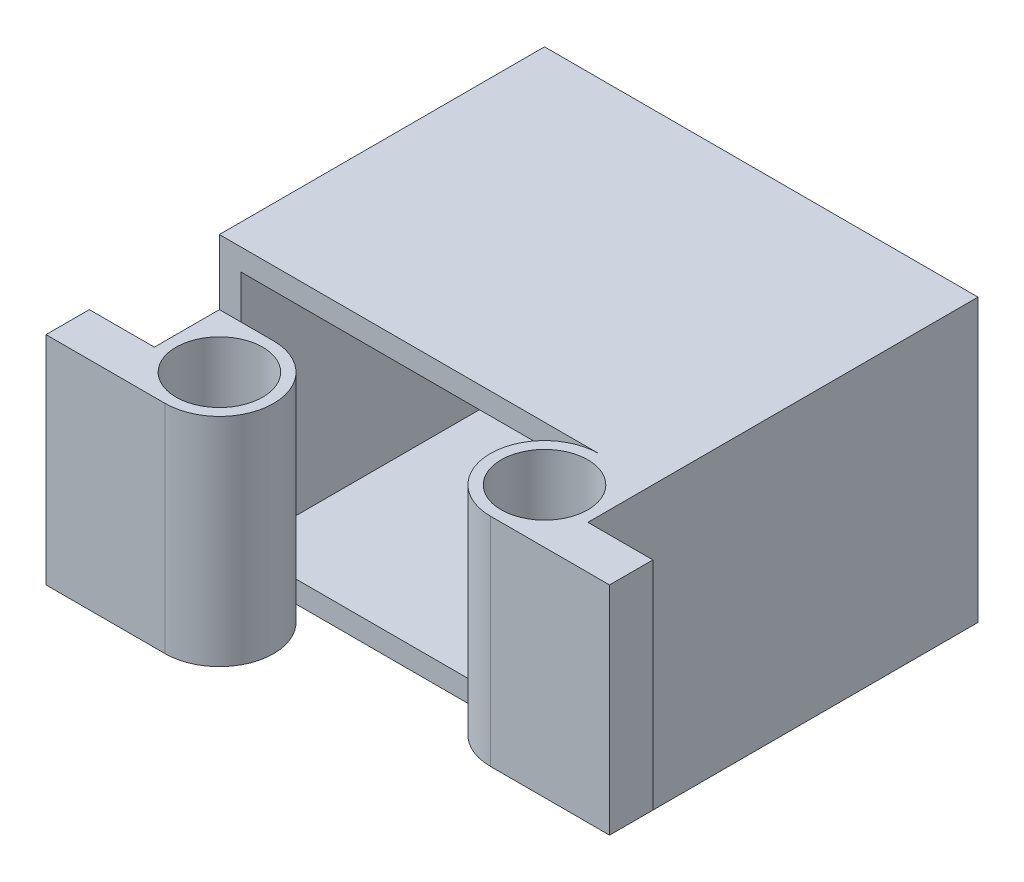
ISO-10303-21;
HEADER;
FILE_DESCRIPTION(('STEP AP214'),'2;1');
FILE_NAME('part.step','',(''),(''),'','','');
FILE_SCHEMA(('AUTOMOTIVE_DESIGN { 1 0 10303 214 1 1 1 1 }'));
ENDSEC;
DATA;
#1=APPLICATION_CONTEXT('core data for automotive mechanical design processes');
#2=APPLICATION_PROTOCOL_DEFINITION('international standard','automotive_design',2000,#1);
#3=PRODUCT_CONTEXT('',#1,'mechanical');
#4=PRODUCT('Part','Part','',(#3));
#5=PRODUCT_RELATED_PRODUCT_CATEGORY('part','',(#4));
#6=PRODUCT_DEFINITION_FORMATION('','',#4);
#7=PRODUCT_DEFINITION_CONTEXT('part definition',#1,'design');
#8=PRODUCT_DEFINITION('design','',#6,#7);
#9=PRODUCT_DEFINITION_SHAPE('','',#8);
#10=(LENGTH_UNIT() NAMED_UNIT(*) SI_UNIT(.MILLI.,.METRE.));
#11=(NAMED_UNIT(*) PLANE_ANGLE_UNIT() SI_UNIT($,.RADIAN.));
#12=(NAMED_UNIT(*) SI_UNIT($,.STERADIAN.) SOLID_ANGLE_UNIT());
#13=UNCERTAINTY_MEASURE_WITH_UNIT(LENGTH_MEASURE(1.E-05),#10,'distance_accuracy_value','');
#14=(GEOMETRIC_REPRESENTATION_CONTEXT(3) GLOBAL_UNCERTAINTY_ASSIGNED_CONTEXT((#13)) GLOBAL_UNIT_ASSIGNED_CONTEXT((#10,
#11,#12)) REPRESENTATION_CONTEXT('',''));
#15=CARTESIAN_POINT('',(0.,0.,0.));
#16=DIRECTION('',(0.,0.,1.));
#17=DIRECTION('',(1.,0.,0.));
#18=AXIS2_PLACEMENT_3D('',#15,#16,#17);
#19=CARTESIAN_POINT('',(10.,-6.5,15.));
#20=DIRECTION('',(-1.,0.,0.));
#21=DIRECTION('',(0.,0.,1.));
#22=AXIS2_PLACEMENT_3D('',#19,#20,#21);
#23=PLANE('',#22);
#24=DIRECTION('',(0.,1.,0.));
#25=VECTOR('',#24,1.);
#26=CARTESIAN_POINT('',(10.,6.5,18.));
#27=LINE('',#26,#25);
#28=CARTESIAN_POINT('',(10.,-3.5,18.));
#29=VERTEX_POINT('',#28);
#30=CARTESIAN_POINT('',(10.,6.5,18.));
#31=VERTEX_POINT('',#30);
#32=EDGE_CURVE('E58',#29,#31,#27,.T.);
#33=ORIENTED_EDGE('',*,*,#32,.F.);
#34=DIRECTION('',(0.,0.,1.));
#35=VECTOR('',#34,1.);
#36=CARTESIAN_POINT('',(10.,-3.5,0.));
#37=LINE('',#36,#35);
#38=CARTESIAN_POINT('',(10.,-3.5,15.));
#39=VERTEX_POINT('',#38);
#40=EDGE_CURVE('E217',#39,#29,#37,.T.);
#41=ORIENTED_EDGE('',*,*,#40,.F.);
#42=DIRECTION('',(0.,1.,0.));
#43=VECTOR('',#42,1.);
#44=CARTESIAN_POINT('',(10.,-6.5,15.));
#45=LINE('',#44,#43);
#46=CARTESIAN_POINT('',(10.,-6.5,15.));
#47=VERTEX_POINT('',#46);
#48=EDGE_CURVE('E375',#47,#39,#45,.T.);
#49=ORIENTED_EDGE('',*,*,#48,.F.);
#50=DIRECTION('',(0.,0.,-1.));
#51=VECTOR('',#50,1.);
#52=CARTESIAN_POINT('',(10.,-6.5,15.));
#53=LINE('',#52,#51);
#54=CARTESIAN_POINT('',(10.,-6.5,0.));
#55=VERTEX_POINT('',#54);
#56=EDGE_CURVE('E390',#47,#55,#53,.T.);
#57=ORIENTED_EDGE('',*,*,#56,.T.);
#58=DIRECTION('',(0.,1.,0.));
#59=VECTOR('',#58,1.);
#60=CARTESIAN_POINT('',(10.,-6.5,0.));
#61=LINE('',#60,#59);
#62=CARTESIAN_POINT('',(10.,6.5,0.));
#63=VERTEX_POINT('',#62);
#64=EDGE_CURVE('E337',#55,#63,#61,.T.);
#65=ORIENTED_EDGE('',*,*,#64,.T.);
#66=DIRECTION('',(0.,0.,-1.));
#67=VECTOR('',#66,1.);
#68=CARTESIAN_POINT('',(10.,6.5,15.));
#69=LINE('',#68,#67);
#70=EDGE_CURVE('E410',#31,#63,#69,.T.);
#71=ORIENTED_EDGE('',*,*,#70,.F.);
#72=EDGE_LOOP('',(#33,#41,#49,#57,#65,#71));
#73=FACE_BOUND('',#72,.T.);
#74=ADVANCED_FACE('F41',(#73),#23,.F.);
#75=CARTESIAN_POINT('',(0.,-6.5,20.));
#76=DIRECTION('',(0.,0.,1.));
#77=DIRECTION('',(1.,0.,0.));
#78=AXIS2_PLACEMENT_3D('',#75,#76,#77);
#79=PLANE('',#78);
#80=DIRECTION('',(1.,0.,0.));
#81=VECTOR('',#80,1.);
#82=CARTESIAN_POINT('',(0.,3.5,20.));
#83=LINE('',#82,#81);
#84=CARTESIAN_POINT('',(-13.,3.5,20.));
#85=VERTEX_POINT('',#84);
#86=CARTESIAN_POINT('',(-7.5,3.5,20.));
#87=VERTEX_POINT('',#86);
#88=EDGE_CURVE('E439',#85,#87,#83,.T.);
#89=ORIENTED_EDGE('',*,*,#88,.F.);
#90=DIRECTION('',(0.,1.,0.));
#91=VECTOR('',#90,1.);
#92=CARTESIAN_POINT('',(-13.,3.5,20.));
#93=LINE('',#92,#91);
#94=CARTESIAN_POINT('',(-13.,-6.5,20.));
#95=VERTEX_POINT('',#94);
#96=EDGE_CURVE('E414',#95,#85,#93,.T.);
#97=ORIENTED_EDGE('',*,*,#96,.F.);
#98=DIRECTION('',(1.,0.,0.));
#99=VECTOR('',#98,1.);
#100=CARTESIAN_POINT('',(0.,-6.5,20.));
#101=LINE('',#100,#99);
#102=CARTESIAN_POINT('',(-7.5,-6.5,20.));
#103=VERTEX_POINT('',#102);
#104=EDGE_CURVE('E440',#95,#103,#101,.T.);
#105=ORIENTED_EDGE('',*,*,#104,.T.);
#106=DIRECTION('',(0.,1.,0.));
#107=VECTOR('',#106,1.);
#108=CARTESIAN_POINT('',(-7.5,-6.5,20.));
#109=LINE('',#108,#107);
#110=EDGE_CURVE('E45',#103,#87,#109,.T.);
#111=ORIENTED_EDGE('',*,*,#110,.T.);
#112=EDGE_LOOP('',(#89,#97,#105,#111));
#113=FACE_BOUND('',#112,.T.);
#114=ADVANCED_FACE('F43',(#113),#79,.T.);
#115=CARTESIAN_POINT('',(-10.,-6.5,0.));
#116=DIRECTION('',(-1.,0.,0.));
#117=DIRECTION('',(0.,0.,1.));
#118=AXIS2_PLACEMENT_3D('',#115,#116,#117);
#119=PLANE('',#118);
#120=DIRECTION('',(0.,-1.,0.));
#121=VECTOR('',#120,1.);
#122=CARTESIAN_POINT('',(-10.,3.5,18.));
#123=LINE('',#122,#121);
#124=CARTESIAN_POINT('',(-10.,3.5,18.));
#125=VERTEX_POINT('',#124);
#126=CARTESIAN_POINT('',(-10.,-6.5,18.));
#127=VERTEX_POINT('',#126);
#128=EDGE_CURVE('E413',#125,#127,#123,.T.);
#129=ORIENTED_EDGE('',*,*,#128,.F.);
#130=DIRECTION('',(0.,0.,1.));
#131=VECTOR('',#130,1.);
#132=CARTESIAN_POINT('',(-10.,3.5,0.));
#133=LINE('',#132,#131);
#134=CARTESIAN_POINT('',(-10.,3.5,15.));
#135=VERTEX_POINT('',#134);
#136=EDGE_CURVE('E467',#135,#125,#133,.T.);
#137=ORIENTED_EDGE('',*,*,#136,.F.);
#138=DIRECTION('',(0.,-1.,0.));
#139=VECTOR('',#138,1.);
#140=CARTESIAN_POINT('',(-10.,-6.5,15.));
#141=LINE('',#140,#139);
#142=CARTESIAN_POINT('',(-10.,6.5,15.));
#143=VERTEX_POINT('',#142);
#144=EDGE_CURVE('E383',#143,#135,#141,.T.);
#145=ORIENTED_EDGE('',*,*,#144,.F.);
#146=DIRECTION('',(0.,0.,-1.));
#147=VECTOR('',#146,1.);
#148=CARTESIAN_POINT('',(-10.,6.5,15.));
#149=LINE('',#148,#147);
#150=CARTESIAN_POINT('',(-10.,6.5,0.));
#151=VERTEX_POINT('',#150);
#152=EDGE_CURVE('E406',#143,#151,#149,.T.);
#153=ORIENTED_EDGE('',*,*,#152,.T.);
#154=DIRECTION('',(0.,-1.,0.));
#155=VECTOR('',#154,1.);
#156=CARTESIAN_POINT('',(-10.,-6.5,0.));
#157=LINE('',#156,#155);
#158=CARTESIAN_POINT('',(-10.,-6.5,0.));
#159=VERTEX_POINT('',#158);
#160=EDGE_CURVE('E397',#151,#159,#157,.T.);
#161=ORIENTED_EDGE('',*,*,#160,.T.);
#162=DIRECTION('',(0.,0.,1.));
#163=VECTOR('',#162,1.);
#164=CARTESIAN_POINT('',(-10.,-6.5,0.));
#165=LINE('',#164,#163);
#166=EDGE_CURVE('E448',#159,#127,#165,.T.);
#167=ORIENTED_EDGE('',*,*,#166,.T.);
#168=EDGE_LOOP('',(#129,#137,#145,#153,#161,#167));
#169=FACE_BOUND('',#168,.T.);
#170=ADVANCED_FACE('F498',(#169),#119,.T.);
#171=CARTESIAN_POINT('',(0.,-6.5,15.));
#172=DIRECTION('',(0.,0.,1.));
#173=DIRECTION('',(1.,0.,0.));
#174=AXIS2_PLACEMENT_3D('',#171,#172,#173);
#175=PLANE('',#174);
#176=DIRECTION('',(1.,0.,0.));
#177=VECTOR('',#176,1.);
#178=CARTESIAN_POINT('',(0.,-5.5,15.));
#179=LINE('',#178,#177);
#180=CARTESIAN_POINT('',(-9.,-5.5,15.));
#181=VERTEX_POINT('',#180);
#182=CARTESIAN_POINT('',(-7.5,-5.5,15.));
#183=VERTEX_POINT('',#182);
#184=EDGE_CURVE('E66',#181,#183,#179,.T.);
#185=ORIENTED_EDGE('',*,*,#184,.F.);
#186=DIRECTION('',(0.,-1.,0.));
#187=VECTOR('',#186,1.);
#188=CARTESIAN_POINT('',(-9.,0.,15.));
#189=LINE('',#188,#187);
#190=CARTESIAN_POINT('',(-9.,3.5,15.));
#191=VERTEX_POINT('',#190);
#192=EDGE_CURVE('E367',#191,#181,#189,.T.);
#193=ORIENTED_EDGE('',*,*,#192,.F.);
#194=DIRECTION('',(1.,0.,0.));
#195=VECTOR('',#194,1.);
#196=CARTESIAN_POINT('',(0.,3.5,15.));
#197=LINE('',#196,#195);
#198=CARTESIAN_POINT('',(-7.5,3.5,15.));
#199=VERTEX_POINT('',#198);
#200=EDGE_CURVE('E462',#191,#199,#197,.T.);
#201=ORIENTED_EDGE('',*,*,#200,.T.);
#202=DIRECTION('',(0.,1.,0.));
#203=VECTOR('',#202,1.);
#204=CARTESIAN_POINT('',(-7.5,-6.5,15.));
#205=LINE('',#204,#203);
#206=EDGE_CURVE('E51',#183,#199,#205,.T.);
#207=ORIENTED_EDGE('',*,*,#206,.F.);
#208=EDGE_LOOP('',(#185,#193,#201,#207));
#209=FACE_BOUND('',#208,.T.);
#210=ADVANCED_FACE('F643',(#209),#175,.F.);
#211=CARTESIAN_POINT('',(-7.5,-6.5,17.5));
#212=DIRECTION('',(0.,1.,0.));
#213=DIRECTION('',(0.,0.,1.));
#214=AXIS2_PLACEMENT_3D('',#211,#212,#213);
#215=CYLINDRICAL_SURFACE('',#214,2.5);
#216=CARTESIAN_POINT('',(-7.5,3.5,17.5));
#217=DIRECTION('',(0.,1.,0.));
#218=DIRECTION('',(0.,0.,1.));
#219=AXIS2_PLACEMENT_3D('',#216,#217,#218);
#220=CIRCLE('',#219,2.5);
#221=EDGE_CURVE('E458',#87,#199,#220,.T.);
#222=ORIENTED_EDGE('',*,*,#221,.F.);
#223=ORIENTED_EDGE('',*,*,#110,.F.);
#224=CARTESIAN_POINT('',(-7.5,-6.5,17.5));
#225=DIRECTION('',(0.,1.,0.));
#226=DIRECTION('',(0.,0.,1.));
#227=AXIS2_PLACEMENT_3D('',#224,#225,#226);
#228=CIRCLE('',#227,2.5);
#229=CARTESIAN_POINT('',(-7.5,-6.5,15.));
#230=VERTEX_POINT('',#229);
#231=EDGE_CURVE('E444',#103,#230,#228,.T.);
#232=ORIENTED_EDGE('',*,*,#231,.T.);
#233=EDGE_CURVE('E11',#230,#183,#205,.T.);
#234=ORIENTED_EDGE('',*,*,#233,.T.);
#235=ORIENTED_EDGE('',*,*,#206,.T.);
#236=EDGE_LOOP('',(#222,#223,#232,#234,#235));
#237=FACE_BOUND('',#236,.T.);
#238=ADVANCED_FACE('F527',(#237),#215,.T.);
#239=CARTESIAN_POINT('',(-7.5,-6.5,17.5));
#240=DIRECTION('',(0.,1.,0.));
#241=DIRECTION('',(0.,0.,1.));
#242=AXIS2_PLACEMENT_3D('',#239,#240,#241);
#243=CYLINDRICAL_SURFACE('',#242,2.);
#244=CARTESIAN_POINT('',(-7.5,-6.5,17.5));
#245=DIRECTION('',(0.,1.,0.));
#246=DIRECTION('',(0.,0.,1.));
#247=AXIS2_PLACEMENT_3D('',#244,#245,#246);
#248=CIRCLE('',#247,2.);
#249=CARTESIAN_POINT('',(-7.5,-6.5,19.5));
#250=VERTEX_POINT('',#249);
#251=EDGE_CURVE('E451',#250,#250,#248,.T.);
#252=ORIENTED_EDGE('',*,*,#251,.F.);
#253=EDGE_LOOP('',(#252));
#254=FACE_BOUND('',#253,.T.);
#255=CARTESIAN_POINT('',(-7.5,3.5,17.5));
#256=DIRECTION('',(0.,1.,0.));
#257=DIRECTION('',(0.,0.,1.));
#258=AXIS2_PLACEMENT_3D('',#255,#256,#257);
#259=CIRCLE('',#258,2.);
#260=CARTESIAN_POINT('',(-7.5,3.5,19.5));
#261=VERTEX_POINT('',#260);
#262=EDGE_CURVE('E445',#261,#261,#259,.T.);
#263=ORIENTED_EDGE('',*,*,#262,.T.);
#264=EDGE_LOOP('',(#263));
#265=FACE_BOUND('',#264,.T.);
#266=ADVANCED_FACE('F475',(#254,#265),#243,.F.);
#267=CARTESIAN_POINT('',(0.,-6.5,0.));
#268=DIRECTION('',(0.,1.,0.));
#269=DIRECTION('',(0.,0.,1.));
#270=AXIS2_PLACEMENT_3D('',#267,#268,#269);
#271=PLANE('',#270);
#272=ORIENTED_EDGE('',*,*,#104,.F.);
#273=DIRECTION('',(0.,0.,1.));
#274=VECTOR('',#273,1.);
#275=CARTESIAN_POINT('',(-13.,-6.5,20.));
#276=LINE('',#275,#274);
#277=CARTESIAN_POINT('',(-13.,-6.5,18.));
#278=VERTEX_POINT('',#277);
#279=EDGE_CURVE('E424',#278,#95,#276,.T.);
#280=ORIENTED_EDGE('',*,*,#279,.F.);
#281=DIRECTION('',(1.,0.,0.));
#282=VECTOR('',#281,1.);
#283=CARTESIAN_POINT('',(-13.,-6.5,18.));
#284=LINE('',#283,#282);
#285=EDGE_CURVE('E428',#278,#127,#284,.T.);
#286=ORIENTED_EDGE('',*,*,#285,.T.);
#287=ORIENTED_EDGE('',*,*,#166,.F.);
#288=DIRECTION('',(1.,0.,0.));
#289=VECTOR('',#288,1.);
#290=CARTESIAN_POINT('',(-10.,-6.5,0.));
#291=LINE('',#290,#289);
#292=EDGE_CURVE('E380',#159,#55,#291,.T.);
#293=ORIENTED_EDGE('',*,*,#292,.T.);
#294=ORIENTED_EDGE('',*,*,#56,.F.);
#295=DIRECTION('',(1.,0.,0.));
#296=VECTOR('',#295,1.);
#297=CARTESIAN_POINT('',(-10.,-6.5,15.));
#298=LINE('',#297,#296);
#299=EDGE_CURVE('E387',#230,#47,#298,.T.);
#300=ORIENTED_EDGE('',*,*,#299,.F.);
#301=ORIENTED_EDGE('',*,*,#231,.F.);
#302=EDGE_LOOP('',(#272,#280,#286,#287,#293,#294,#300,#301));
#303=FACE_BOUND('',#302,.T.);
#304=ORIENTED_EDGE('',*,*,#251,.T.);
#305=EDGE_LOOP('',(#304));
#306=FACE_BOUND('',#305,.T.);
#307=ADVANCED_FACE('F480',(#303,#306),#271,.F.);
#308=CARTESIAN_POINT('',(0.,3.5,0.));
#309=DIRECTION('',(0.,1.,0.));
#310=DIRECTION('',(0.,0.,1.));
#311=AXIS2_PLACEMENT_3D('',#308,#309,#310);
#312=PLANE('',#311);
#313=ORIENTED_EDGE('',*,*,#88,.T.);
#314=ORIENTED_EDGE('',*,*,#221,.T.);
#315=ORIENTED_EDGE('',*,*,#200,.F.);
#316=EDGE_CURVE('E463',#135,#191,#197,.T.);
#317=ORIENTED_EDGE('',*,*,#316,.F.);
#318=ORIENTED_EDGE('',*,*,#136,.T.);
#319=DIRECTION('',(1.,0.,0.));
#320=VECTOR('',#319,1.);
#321=CARTESIAN_POINT('',(-13.,3.5,18.));
#322=LINE('',#321,#320);
#323=CARTESIAN_POINT('',(-13.,3.5,18.));
#324=VERTEX_POINT('',#323);
#325=EDGE_CURVE('E435',#324,#125,#322,.T.);
#326=ORIENTED_EDGE('',*,*,#325,.F.);
#327=DIRECTION('',(0.,0.,-1.));
#328=VECTOR('',#327,1.);
#329=CARTESIAN_POINT('',(-13.,3.5,20.));
#330=LINE('',#329,#328);
#331=EDGE_CURVE('E418',#85,#324,#330,.T.);
#332=ORIENTED_EDGE('',*,*,#331,.F.);
#333=EDGE_LOOP('',(#313,#314,#315,#317,#318,#326,#332));
#334=FACE_BOUND('',#333,.T.);
#335=ORIENTED_EDGE('',*,*,#262,.F.);
#336=EDGE_LOOP('',(#335));
#337=FACE_BOUND('',#336,.T.);
#338=ADVANCED_FACE('F477',(#334,#337),#312,.T.);
#339=CARTESIAN_POINT('',(-13.,3.5,18.));
#340=DIRECTION('',(0.,0.,1.));
#341=DIRECTION('',(1.,0.,0.));
#342=AXIS2_PLACEMENT_3D('',#339,#340,#341);
#343=PLANE('',#342);
#344=ORIENTED_EDGE('',*,*,#128,.T.);
#345=ORIENTED_EDGE('',*,*,#285,.F.);
#346=DIRECTION('',(0.,-1.,0.));
#347=VECTOR('',#346,1.);
#348=CARTESIAN_POINT('',(-13.,3.5,18.));
#349=LINE('',#348,#347);
#350=EDGE_CURVE('E421',#324,#278,#349,.T.);
#351=ORIENTED_EDGE('',*,*,#350,.F.);
#352=ORIENTED_EDGE('',*,*,#325,.T.);
#353=EDGE_LOOP('',(#344,#345,#351,#352));
#354=FACE_BOUND('',#353,.T.);
#355=ADVANCED_FACE('F479',(#354),#343,.F.);
#356=CARTESIAN_POINT('',(-13.,0.,0.));
#357=DIRECTION('',(1.,0.,0.));
#358=DIRECTION('',(0.,0.,-1.));
#359=AXIS2_PLACEMENT_3D('',#356,#357,#358);
#360=PLANE('',#359);
#361=ORIENTED_EDGE('',*,*,#96,.T.);
#362=ORIENTED_EDGE('',*,*,#331,.T.);
#363=ORIENTED_EDGE('',*,*,#350,.T.);
#364=ORIENTED_EDGE('',*,*,#279,.T.);
#365=EDGE_LOOP('',(#361,#362,#363,#364));
#366=FACE_BOUND('',#365,.T.);
#367=ADVANCED_FACE('F487',(#366),#360,.F.);
#368=CARTESIAN_POINT('',(0.,0.,15.));
#369=DIRECTION('',(0.,0.,-1.));
#370=DIRECTION('',(-1.,0.,0.));
#371=AXIS2_PLACEMENT_3D('',#368,#369,#370);
#372=PLANE('',#371);
#373=CARTESIAN_POINT('',(9.,-5.5,15.));
#374=VERTEX_POINT('',#373);
#375=EDGE_CURVE('E372',#183,#374,#179,.T.);
#376=ORIENTED_EDGE('',*,*,#375,.F.);
#377=ORIENTED_EDGE('',*,*,#233,.F.);
#378=ORIENTED_EDGE('',*,*,#299,.T.);
#379=ORIENTED_EDGE('',*,*,#48,.T.);
#380=DIRECTION('',(1.,0.,0.));
#381=VECTOR('',#380,1.);
#382=CARTESIAN_POINT('',(0.,-3.5,15.));
#383=LINE('',#382,#381);
#384=CARTESIAN_POINT('',(9.,-3.5,15.));
#385=VERTEX_POINT('',#384);
#386=EDGE_CURVE('E255',#385,#39,#383,.T.);
#387=ORIENTED_EDGE('',*,*,#386,.F.);
#388=DIRECTION('',(0.,1.,0.));
#389=VECTOR('',#388,1.);
#390=CARTESIAN_POINT('',(9.,0.,15.));
#391=LINE('',#390,#389);
#392=EDGE_CURVE('E358',#374,#385,#391,.T.);
#393=ORIENTED_EDGE('',*,*,#392,.F.);
#394=EDGE_LOOP('',(#376,#377,#378,#379,#387,#393));
#395=FACE_BOUND('',#394,.T.);
#396=ADVANCED_FACE('F505',(#395),#372,.F.);
#397=ORIENTED_EDGE('',*,*,#316,.T.);
#398=CARTESIAN_POINT('',(-9.,5.5,15.));
#399=VERTEX_POINT('',#398);
#400=EDGE_CURVE('E368',#399,#191,#189,.T.);
#401=ORIENTED_EDGE('',*,*,#400,.F.);
#402=DIRECTION('',(-1.,0.,0.));
#403=VECTOR('',#402,1.);
#404=CARTESIAN_POINT('',(0.,5.5,15.));
#405=LINE('',#404,#403);
#406=CARTESIAN_POINT('',(7.5,5.5,15.));
#407=VERTEX_POINT('',#406);
#408=EDGE_CURVE('E362',#407,#399,#405,.T.);
#409=ORIENTED_EDGE('',*,*,#408,.F.);
#410=DIRECTION('',(0.,1.,0.));
#411=VECTOR('',#410,1.);
#412=CARTESIAN_POINT('',(7.5,-3.5,15.));
#413=LINE('',#412,#411);
#414=CARTESIAN_POINT('',(7.5,6.5,15.));
#415=VERTEX_POINT('',#414);
#416=EDGE_CURVE('E264',#407,#415,#413,.T.);
#417=ORIENTED_EDGE('',*,*,#416,.T.);
#418=DIRECTION('',(-1.,0.,0.));
#419=VECTOR('',#418,1.);
#420=CARTESIAN_POINT('',(-10.,6.5,15.));
#421=LINE('',#420,#419);
#422=EDGE_CURVE('E379',#415,#143,#421,.T.);
#423=ORIENTED_EDGE('',*,*,#422,.T.);
#424=ORIENTED_EDGE('',*,*,#144,.T.);
#425=EDGE_LOOP('',(#397,#401,#409,#417,#423,#424));
#426=FACE_BOUND('',#425,.T.);
#427=ADVANCED_FACE('F510',(#426),#372,.F.);
#428=CARTESIAN_POINT('',(-10.,6.5,15.));
#429=DIRECTION('',(0.,-1.,0.));
#430=DIRECTION('',(0.,0.,-1.));
#431=AXIS2_PLACEMENT_3D('',#428,#429,#430);
#432=PLANE('',#431);
#433=DIRECTION('',(-1.,0.,0.));
#434=VECTOR('',#433,1.);
#435=CARTESIAN_POINT('',(-10.,6.5,0.));
#436=LINE('',#435,#434);
#437=EDGE_CURVE('E394',#63,#151,#436,.T.);
#438=ORIENTED_EDGE('',*,*,#437,.T.);
#439=ORIENTED_EDGE('',*,*,#152,.F.);
#440=ORIENTED_EDGE('',*,*,#422,.F.);
#441=CARTESIAN_POINT('',(7.5,6.5,17.5));
#442=DIRECTION('',(0.,1.,0.));
#443=DIRECTION('',(0.,0.,1.));
#444=AXIS2_PLACEMENT_3D('',#441,#442,#443);
#445=CIRCLE('',#444,2.5);
#446=CARTESIAN_POINT('',(7.5,6.5,20.));
#447=VERTEX_POINT('',#446);
#448=EDGE_CURVE('E251',#415,#447,#445,.T.);
#449=ORIENTED_EDGE('',*,*,#448,.T.);
#450=DIRECTION('',(1.,0.,0.));
#451=VECTOR('',#450,1.);
#452=CARTESIAN_POINT('',(0.,6.5,20.));
#453=LINE('',#452,#451);
#454=CARTESIAN_POINT('',(13.,6.5,20.));
#455=VERTEX_POINT('',#454);
#456=EDGE_CURVE('E268',#447,#455,#453,.T.);
#457=ORIENTED_EDGE('',*,*,#456,.T.);
#458=DIRECTION('',(0.,0.,1.));
#459=VECTOR('',#458,1.);
#460=CARTESIAN_POINT('',(13.,6.5,20.));
#461=LINE('',#460,#459);
#462=CARTESIAN_POINT('',(13.,6.5,18.));
#463=VERTEX_POINT('',#462);
#464=EDGE_CURVE('E235',#463,#455,#461,.T.);
#465=ORIENTED_EDGE('',*,*,#464,.F.);
#466=DIRECTION('',(-1.,0.,0.));
#467=VECTOR('',#466,1.);
#468=CARTESIAN_POINT('',(13.,6.5,18.));
#469=LINE('',#468,#467);
#470=EDGE_CURVE('E244',#463,#31,#469,.T.);
#471=ORIENTED_EDGE('',*,*,#470,.T.);
#472=ORIENTED_EDGE('',*,*,#70,.T.);
#473=EDGE_LOOP('',(#438,#439,#440,#449,#457,#465,#471,#472));
#474=FACE_BOUND('',#473,.T.);
#475=CARTESIAN_POINT('',(7.5,6.5,17.5));
#476=DIRECTION('',(0.,1.,0.));
#477=DIRECTION('',(0.,0.,1.));
#478=AXIS2_PLACEMENT_3D('',#475,#476,#477);
#479=CIRCLE('',#478,2.);
#480=CARTESIAN_POINT('',(7.5,6.5,19.5));
#481=VERTEX_POINT('',#480);
#482=EDGE_CURVE('E271',#481,#481,#479,.T.);
#483=ORIENTED_EDGE('',*,*,#482,.F.);
#484=EDGE_LOOP('',(#483));
#485=FACE_BOUND('',#484,.T.);
#486=ADVANCED_FACE('F502',(#474,#485),#432,.F.);
#487=CARTESIAN_POINT('',(0.,0.,0.));
#488=DIRECTION('',(0.,0.,-1.));
#489=DIRECTION('',(-1.,0.,0.));
#490=AXIS2_PLACEMENT_3D('',#487,#488,#489);
#491=PLANE('',#490);
#492=ORIENTED_EDGE('',*,*,#64,.F.);
#493=ORIENTED_EDGE('',*,*,#292,.F.);
#494=ORIENTED_EDGE('',*,*,#160,.F.);
#495=ORIENTED_EDGE('',*,*,#437,.F.);
#496=EDGE_LOOP('',(#492,#493,#494,#495));
#497=FACE_BOUND('',#496,.T.);
#498=ADVANCED_FACE('F554',(#497),#491,.T.);
#499=CARTESIAN_POINT('',(9.,-6.5,15.));
#500=DIRECTION('',(-1.,0.,0.));
#501=DIRECTION('',(0.,0.,1.));
#502=AXIS2_PLACEMENT_3D('',#499,#500,#501);
#503=PLANE('',#502);
#504=DIRECTION('',(0.,1.,0.));
#505=VECTOR('',#504,1.);
#506=CARTESIAN_POINT('',(9.,0.,1.));
#507=LINE('',#506,#505);
#508=CARTESIAN_POINT('',(9.,-5.5,1.));
#509=VERTEX_POINT('',#508);
#510=CARTESIAN_POINT('',(9.,5.5,1.));
#511=VERTEX_POINT('',#510);
#512=EDGE_CURVE('E319',#509,#511,#507,.T.);
#513=ORIENTED_EDGE('',*,*,#512,.F.);
#514=DIRECTION('',(0.,0.,-1.));
#515=VECTOR('',#514,1.);
#516=CARTESIAN_POINT('',(9.,-5.5,15.));
#517=LINE('',#516,#515);
#518=EDGE_CURVE('E339',#374,#509,#517,.T.);
#519=ORIENTED_EDGE('',*,*,#518,.F.);
#520=ORIENTED_EDGE('',*,*,#392,.T.);
#521=DIRECTION('',(0.,1.,0.));
#522=VECTOR('',#521,1.);
#523=CARTESIAN_POINT('',(9.,-6.5,15.));
#524=LINE('',#523,#522);
#525=CARTESIAN_POINT('',(9.,5.5,15.));
#526=VERTEX_POINT('',#525);
#527=EDGE_CURVE('E277',#385,#526,#524,.T.);
#528=ORIENTED_EDGE('',*,*,#527,.T.);
#529=DIRECTION('',(0.,0.,-1.));
#530=VECTOR('',#529,1.);
#531=CARTESIAN_POINT('',(9.,5.5,15.));
#532=LINE('',#531,#530);
#533=EDGE_CURVE('E333',#526,#511,#532,.T.);
#534=ORIENTED_EDGE('',*,*,#533,.T.);
#535=EDGE_LOOP('',(#513,#519,#520,#528,#534));
#536=FACE_BOUND('',#535,.T.);
#537=ADVANCED_FACE('F572',(#536),#503,.T.);
#538=CARTESIAN_POINT('',(-10.,5.5,15.));
#539=DIRECTION('',(0.,-1.,0.));
#540=DIRECTION('',(0.,0.,-1.));
#541=AXIS2_PLACEMENT_3D('',#538,#539,#540);
#542=PLANE('',#541);
#543=DIRECTION('',(-1.,0.,0.));
#544=VECTOR('',#543,1.);
#545=CARTESIAN_POINT('',(0.,5.5,1.));
#546=LINE('',#545,#544);
#547=CARTESIAN_POINT('',(-9.,5.5,1.));
#548=VERTEX_POINT('',#547);
#549=EDGE_CURVE('E332',#511,#548,#546,.T.);
#550=ORIENTED_EDGE('',*,*,#549,.F.);
#551=ORIENTED_EDGE('',*,*,#533,.F.);
#552=EDGE_CURVE('E363',#526,#407,#405,.T.);
#553=ORIENTED_EDGE('',*,*,#552,.T.);
#554=ORIENTED_EDGE('',*,*,#408,.T.);
#555=DIRECTION('',(0.,0.,-1.));
#556=VECTOR('',#555,1.);
#557=CARTESIAN_POINT('',(-9.,5.5,15.));
#558=LINE('',#557,#556);
#559=EDGE_CURVE('E338',#399,#548,#558,.T.);
#560=ORIENTED_EDGE('',*,*,#559,.T.);
#561=EDGE_LOOP('',(#550,#551,#553,#554,#560));
#562=FACE_BOUND('',#561,.T.);
#563=ADVANCED_FACE('F574',(#562),#542,.T.);
#564=CARTESIAN_POINT('',(-9.,-6.5,15.));
#565=DIRECTION('',(1.,0.,0.));
#566=DIRECTION('',(0.,0.,-1.));
#567=AXIS2_PLACEMENT_3D('',#564,#565,#566);
#568=PLANE('',#567);
#569=DIRECTION('',(0.,-1.,0.));
#570=VECTOR('',#569,1.);
#571=CARTESIAN_POINT('',(-9.,0.,1.));
#572=LINE('',#571,#570);
#573=CARTESIAN_POINT('',(-9.,-5.5,1.));
#574=VERTEX_POINT('',#573);
#575=EDGE_CURVE('E346',#548,#574,#572,.T.);
#576=ORIENTED_EDGE('',*,*,#575,.F.);
#577=ORIENTED_EDGE('',*,*,#559,.F.);
#578=ORIENTED_EDGE('',*,*,#400,.T.);
#579=ORIENTED_EDGE('',*,*,#192,.T.);
#580=DIRECTION('',(0.,0.,-1.));
#581=VECTOR('',#580,1.);
#582=CARTESIAN_POINT('',(-9.,-5.5,15.));
#583=LINE('',#582,#581);
#584=EDGE_CURVE('E343',#181,#574,#583,.T.);
#585=ORIENTED_EDGE('',*,*,#584,.T.);
#586=EDGE_LOOP('',(#576,#577,#578,#579,#585));
#587=FACE_BOUND('',#586,.T.);
#588=ADVANCED_FACE('F539',(#587),#568,.T.);
#589=CARTESIAN_POINT('',(-10.,-5.5,15.));
#590=DIRECTION('',(0.,1.,0.));
#591=DIRECTION('',(0.,0.,1.));
#592=AXIS2_PLACEMENT_3D('',#589,#590,#591);
#593=PLANE('',#592);
#594=DIRECTION('',(1.,0.,0.));
#595=VECTOR('',#594,1.);
#596=CARTESIAN_POINT('',(0.,-5.5,1.));
#597=LINE('',#596,#595);
#598=EDGE_CURVE('E352',#574,#509,#597,.T.);
#599=ORIENTED_EDGE('',*,*,#598,.F.);
#600=ORIENTED_EDGE('',*,*,#584,.F.);
#601=ORIENTED_EDGE('',*,*,#184,.T.);
#602=ORIENTED_EDGE('',*,*,#375,.T.);
#603=ORIENTED_EDGE('',*,*,#518,.T.);
#604=EDGE_LOOP('',(#599,#600,#601,#602,#603));
#605=FACE_BOUND('',#604,.T.);
#606=ADVANCED_FACE('F536',(#605),#593,.T.);
#607=CARTESIAN_POINT('',(0.,0.,1.));
#608=DIRECTION('',(0.,0.,-1.));
#609=DIRECTION('',(-1.,0.,0.));
#610=AXIS2_PLACEMENT_3D('',#607,#608,#609);
#611=PLANE('',#610);
#612=DIRECTION('',(0.,-1.,0.));
#613=VECTOR('',#612,1.);
#614=CARTESIAN_POINT('',(-4.9,0.,1.));
#615=LINE('',#614,#613);
#616=CARTESIAN_POINT('',(-4.9,4.9,1.));
#617=VERTEX_POINT('',#616);
#618=CARTESIAN_POINT('',(-4.9,-4.9,1.));
#619=VERTEX_POINT('',#618);
#620=EDGE_CURVE('E305',#617,#619,#615,.T.);
#621=ORIENTED_EDGE('',*,*,#620,.F.);
#622=DIRECTION('',(1.,0.,0.));
#623=VECTOR('',#622,1.);
#624=CARTESIAN_POINT('',(0.,4.9,1.));
#625=LINE('',#624,#623);
#626=CARTESIAN_POINT('',(4.9,4.9,1.));
#627=VERTEX_POINT('',#626);
#628=EDGE_CURVE('E284',#617,#627,#625,.T.);
#629=ORIENTED_EDGE('',*,*,#628,.T.);
#630=DIRECTION('',(0.,-1.,0.));
#631=VECTOR('',#630,1.);
#632=CARTESIAN_POINT('',(4.9,0.,1.));
#633=LINE('',#632,#631);
#634=CARTESIAN_POINT('',(4.9,-4.9,1.));
#635=VERTEX_POINT('',#634);
#636=EDGE_CURVE('E290',#627,#635,#633,.T.);
#637=ORIENTED_EDGE('',*,*,#636,.T.);
#638=DIRECTION('',(1.,0.,0.));
#639=VECTOR('',#638,1.);
#640=CARTESIAN_POINT('',(0.,-4.9,1.));
#641=LINE('',#640,#639);
#642=EDGE_CURVE('E309',#619,#635,#641,.T.);
#643=ORIENTED_EDGE('',*,*,#642,.F.);
#644=EDGE_LOOP('',(#621,#629,#637,#643));
#645=FACE_BOUND('',#644,.T.);
#646=ORIENTED_EDGE('',*,*,#512,.T.);
#647=ORIENTED_EDGE('',*,*,#549,.T.);
#648=ORIENTED_EDGE('',*,*,#575,.T.);
#649=ORIENTED_EDGE('',*,*,#598,.T.);
#650=EDGE_LOOP('',(#646,#647,#648,#649));
#651=FACE_BOUND('',#650,.T.);
#652=ADVANCED_FACE('F576',(#645,#651),#611,.F.);
#653=CARTESIAN_POINT('',(0.,4.9,0.8));
#654=DIRECTION('',(0.,-1.,0.));
#655=DIRECTION('',(0.,0.,-1.));
#656=AXIS2_PLACEMENT_3D('',#653,#654,#655);
#657=PLANE('',#656);
#658=ORIENTED_EDGE('',*,*,#628,.F.);
#659=DIRECTION('',(0.,0.,1.));
#660=VECTOR('',#659,1.);
#661=CARTESIAN_POINT('',(-4.9,4.9,0.8));
#662=LINE('',#661,#660);
#663=CARTESIAN_POINT('',(-4.9,4.9,0.8));
#664=VERTEX_POINT('',#663);
#665=EDGE_CURVE('E301',#664,#617,#662,.T.);
#666=ORIENTED_EDGE('',*,*,#665,.F.);
#667=DIRECTION('',(1.,0.,0.));
#668=VECTOR('',#667,1.);
#669=CARTESIAN_POINT('',(0.,4.9,0.8));
#670=LINE('',#669,#668);
#671=CARTESIAN_POINT('',(4.9,4.9,0.8));
#672=VERTEX_POINT('',#671);
#673=EDGE_CURVE('E285',#664,#672,#670,.T.);
#674=ORIENTED_EDGE('',*,*,#673,.T.);
#675=DIRECTION('',(0.,0.,1.));
#676=VECTOR('',#675,1.);
#677=CARTESIAN_POINT('',(4.9,4.9,0.8));
#678=LINE('',#677,#676);
#679=EDGE_CURVE('E315',#672,#627,#678,.T.);
#680=ORIENTED_EDGE('',*,*,#679,.T.);
#681=EDGE_LOOP('',(#658,#666,#674,#680));
#682=FACE_BOUND('',#681,.T.);
#683=ADVANCED_FACE('F578',(#682),#657,.T.);
#684=CARTESIAN_POINT('',(4.9,0.,0.8));
#685=DIRECTION('',(-1.,0.,0.));
#686=DIRECTION('',(0.,0.,1.));
#687=AXIS2_PLACEMENT_3D('',#684,#685,#686);
#688=PLANE('',#687);
#689=ORIENTED_EDGE('',*,*,#636,.F.);
#690=ORIENTED_EDGE('',*,*,#679,.F.);
#691=DIRECTION('',(0.,-1.,0.));
#692=VECTOR('',#691,1.);
#693=CARTESIAN_POINT('',(4.9,0.,0.8));
#694=LINE('',#693,#692);
#695=CARTESIAN_POINT('',(4.9,-4.9,0.8));
#696=VERTEX_POINT('',#695);
#697=EDGE_CURVE('E298',#672,#696,#694,.T.);
#698=ORIENTED_EDGE('',*,*,#697,.T.);
#699=DIRECTION('',(0.,0.,1.));
#700=VECTOR('',#699,1.);
#701=CARTESIAN_POINT('',(4.9,-4.9,0.8));
#702=LINE('',#701,#700);
#703=EDGE_CURVE('E320',#696,#635,#702,.T.);
#704=ORIENTED_EDGE('',*,*,#703,.T.);
#705=EDGE_LOOP('',(#689,#690,#698,#704));
#706=FACE_BOUND('',#705,.T.);
#707=ADVANCED_FACE('F585',(#706),#688,.T.);
#708=CARTESIAN_POINT('',(0.,-4.9,0.8));
#709=DIRECTION('',(0.,-1.,0.));
#710=DIRECTION('',(0.,0.,-1.));
#711=AXIS2_PLACEMENT_3D('',#708,#709,#710);
#712=PLANE('',#711);
#713=ORIENTED_EDGE('',*,*,#642,.T.);
#714=ORIENTED_EDGE('',*,*,#703,.F.);
#715=DIRECTION('',(1.,0.,0.));
#716=VECTOR('',#715,1.);
#717=CARTESIAN_POINT('',(0.,-4.9,0.8));
#718=LINE('',#717,#716);
#719=CARTESIAN_POINT('',(-4.9,-4.9,0.8));
#720=VERTEX_POINT('',#719);
#721=EDGE_CURVE('E294',#720,#696,#718,.T.);
#722=ORIENTED_EDGE('',*,*,#721,.F.);
#723=DIRECTION('',(0.,0.,1.));
#724=VECTOR('',#723,1.);
#725=CARTESIAN_POINT('',(-4.9,-4.9,0.8));
#726=LINE('',#725,#724);
#727=EDGE_CURVE('E324',#720,#619,#726,.T.);
#728=ORIENTED_EDGE('',*,*,#727,.T.);
#729=EDGE_LOOP('',(#713,#714,#722,#728));
#730=FACE_BOUND('',#729,.T.);
#731=ADVANCED_FACE('F777',(#730),#712,.F.);
#732=CARTESIAN_POINT('',(-4.9,0.,0.8));
#733=DIRECTION('',(-1.,0.,0.));
#734=DIRECTION('',(0.,0.,1.));
#735=AXIS2_PLACEMENT_3D('',#732,#733,#734);
#736=PLANE('',#735);
#737=ORIENTED_EDGE('',*,*,#620,.T.);
#738=ORIENTED_EDGE('',*,*,#727,.F.);
#739=DIRECTION('',(0.,-1.,0.));
#740=VECTOR('',#739,1.);
#741=CARTESIAN_POINT('',(-4.9,0.,0.8));
#742=LINE('',#741,#740);
#743=EDGE_CURVE('E289',#664,#720,#742,.T.);
#744=ORIENTED_EDGE('',*,*,#743,.F.);
#745=ORIENTED_EDGE('',*,*,#665,.T.);
#746=EDGE_LOOP('',(#737,#738,#744,#745));
#747=FACE_BOUND('',#746,.T.);
#748=ADVANCED_FACE('F759',(#747),#736,.F.);
#749=CARTESIAN_POINT('',(0.,0.,0.8));
#750=DIRECTION('',(0.,0.,1.));
#751=DIRECTION('',(1.,0.,0.));
#752=AXIS2_PLACEMENT_3D('',#749,#750,#751);
#753=PLANE('',#752);
#754=ORIENTED_EDGE('',*,*,#673,.F.);
#755=ORIENTED_EDGE('',*,*,#743,.T.);
#756=ORIENTED_EDGE('',*,*,#721,.T.);
#757=ORIENTED_EDGE('',*,*,#697,.F.);
#758=EDGE_LOOP('',(#754,#755,#756,#757));
#759=FACE_BOUND('',#758,.T.);
#760=ADVANCED_FACE('F748',(#759),#753,.T.);
#761=CARTESIAN_POINT('',(0.,-3.5,15.));
#762=DIRECTION('',(0.,0.,1.));
#763=DIRECTION('',(1.,0.,0.));
#764=AXIS2_PLACEMENT_3D('',#761,#762,#763);
#765=PLANE('',#764);
#766=ORIENTED_EDGE('',*,*,#527,.F.);
#767=CARTESIAN_POINT('',(7.5,-3.5,15.));
#768=VERTEX_POINT('',#767);
#769=EDGE_CURVE('E252',#768,#385,#383,.T.);
#770=ORIENTED_EDGE('',*,*,#769,.F.);
#771=EDGE_CURVE('E278',#768,#407,#413,.T.);
#772=ORIENTED_EDGE('',*,*,#771,.T.);
#773=ORIENTED_EDGE('',*,*,#552,.F.);
#774=EDGE_LOOP('',(#766,#770,#772,#773));
#775=FACE_BOUND('',#774,.T.);
#776=ADVANCED_FACE('F568',(#775),#765,.F.);
#777=CARTESIAN_POINT('',(0.,-3.5,20.));
#778=DIRECTION('',(0.,0.,1.));
#779=DIRECTION('',(1.,0.,0.));
#780=AXIS2_PLACEMENT_3D('',#777,#778,#779);
#781=PLANE('',#780);
#782=ORIENTED_EDGE('',*,*,#456,.F.);
#783=DIRECTION('',(0.,1.,0.));
#784=VECTOR('',#783,1.);
#785=CARTESIAN_POINT('',(7.5,-3.5,20.));
#786=LINE('',#785,#784);
#787=CARTESIAN_POINT('',(7.5,-3.5,20.));
#788=VERTEX_POINT('',#787);
#789=EDGE_CURVE('E212',#788,#447,#786,.T.);
#790=ORIENTED_EDGE('',*,*,#789,.F.);
#791=DIRECTION('',(1.,0.,0.));
#792=VECTOR('',#791,1.);
#793=CARTESIAN_POINT('',(0.,-3.5,20.));
#794=LINE('',#793,#792);
#795=CARTESIAN_POINT('',(13.,-3.5,20.));
#796=VERTEX_POINT('',#795);
#797=EDGE_CURVE('E206',#788,#796,#794,.T.);
#798=ORIENTED_EDGE('',*,*,#797,.T.);
#799=DIRECTION('',(0.,-1.,0.));
#800=VECTOR('',#799,1.);
#801=CARTESIAN_POINT('',(13.,6.5,20.));
#802=LINE('',#801,#800);
#803=EDGE_CURVE('E211',#455,#796,#802,.T.);
#804=ORIENTED_EDGE('',*,*,#803,.F.);
#805=EDGE_LOOP('',(#782,#790,#798,#804));
#806=FACE_BOUND('',#805,.T.);
#807=ADVANCED_FACE('F209',(#806),#781,.T.);
#808=CARTESIAN_POINT('',(7.5,-3.5,17.5));
#809=DIRECTION('',(0.,1.,0.));
#810=DIRECTION('',(0.,0.,1.));
#811=AXIS2_PLACEMENT_3D('',#808,#809,#810);
#812=CYLINDRICAL_SURFACE('',#811,2.5);
#813=ORIENTED_EDGE('',*,*,#448,.F.);
#814=ORIENTED_EDGE('',*,*,#416,.F.);
#815=ORIENTED_EDGE('',*,*,#771,.F.);
#816=CARTESIAN_POINT('',(7.5,-3.5,17.5));
#817=DIRECTION('',(0.,1.,0.));
#818=DIRECTION('',(0.,0.,1.));
#819=AXIS2_PLACEMENT_3D('',#816,#817,#818);
#820=CIRCLE('',#819,2.5);
#821=EDGE_CURVE('E218',#768,#788,#820,.T.);
#822=ORIENTED_EDGE('',*,*,#821,.T.);
#823=ORIENTED_EDGE('',*,*,#789,.T.);
#824=EDGE_LOOP('',(#813,#814,#815,#822,#823));
#825=FACE_BOUND('',#824,.T.);
#826=ADVANCED_FACE('F566',(#825),#812,.T.);
#827=CARTESIAN_POINT('',(7.5,-3.5,17.5));
#828=DIRECTION('',(0.,1.,0.));
#829=DIRECTION('',(0.,0.,1.));
#830=AXIS2_PLACEMENT_3D('',#827,#828,#829);
#831=CYLINDRICAL_SURFACE('',#830,2.);
#832=CARTESIAN_POINT('',(7.5,-3.5,17.5));
#833=DIRECTION('',(0.,1.,0.));
#834=DIRECTION('',(0.,0.,1.));
#835=AXIS2_PLACEMENT_3D('',#832,#833,#834);
#836=CIRCLE('',#835,2.);
#837=CARTESIAN_POINT('',(7.5,-3.5,19.5));
#838=VERTEX_POINT('',#837);
#839=EDGE_CURVE('E260',#838,#838,#836,.T.);
#840=ORIENTED_EDGE('',*,*,#839,.F.);
#841=EDGE_LOOP('',(#840));
#842=FACE_BOUND('',#841,.T.);
#843=ORIENTED_EDGE('',*,*,#482,.T.);
#844=EDGE_LOOP('',(#843));
#845=FACE_BOUND('',#844,.T.);
#846=ADVANCED_FACE('F707',(#842,#845),#831,.F.);
#847=CARTESIAN_POINT('',(0.,-3.5,0.));
#848=DIRECTION('',(0.,1.,0.));
#849=DIRECTION('',(0.,0.,1.));
#850=AXIS2_PLACEMENT_3D('',#847,#848,#849);
#851=PLANE('',#850);
#852=ORIENTED_EDGE('',*,*,#769,.T.);
#853=ORIENTED_EDGE('',*,*,#386,.T.);
#854=ORIENTED_EDGE('',*,*,#40,.T.);
#855=DIRECTION('',(-1.,0.,0.));
#856=VECTOR('',#855,1.);
#857=CARTESIAN_POINT('',(13.,-3.5,18.));
#858=LINE('',#857,#856);
#859=CARTESIAN_POINT('',(13.,-3.5,18.));
#860=VERTEX_POINT('',#859);
#861=EDGE_CURVE('E226',#860,#29,#858,.T.);
#862=ORIENTED_EDGE('',*,*,#861,.F.);
#863=DIRECTION('',(0.,0.,-1.));
#864=VECTOR('',#863,1.);
#865=CARTESIAN_POINT('',(13.,-3.5,20.));
#866=LINE('',#865,#864);
#867=EDGE_CURVE('E221',#796,#860,#866,.T.);
#868=ORIENTED_EDGE('',*,*,#867,.F.);
#869=ORIENTED_EDGE('',*,*,#797,.F.);
#870=ORIENTED_EDGE('',*,*,#821,.F.);
#871=EDGE_LOOP('',(#852,#853,#854,#862,#868,#869,#870));
#872=FACE_BOUND('',#871,.T.);
#873=ORIENTED_EDGE('',*,*,#839,.T.);
#874=EDGE_LOOP('',(#873));
#875=FACE_BOUND('',#874,.T.);
#876=ADVANCED_FACE('F223',(#872,#875),#851,.F.);
#877=CARTESIAN_POINT('',(13.,6.5,18.));
#878=DIRECTION('',(0.,0.,1.));
#879=DIRECTION('',(1.,0.,0.));
#880=AXIS2_PLACEMENT_3D('',#877,#878,#879);
#881=PLANE('',#880);
#882=ORIENTED_EDGE('',*,*,#32,.T.);
#883=ORIENTED_EDGE('',*,*,#470,.F.);
#884=DIRECTION('',(0.,1.,0.));
#885=VECTOR('',#884,1.);
#886=CARTESIAN_POINT('',(13.,6.5,18.));
#887=LINE('',#886,#885);
#888=EDGE_CURVE('E230',#860,#463,#887,.T.);
#889=ORIENTED_EDGE('',*,*,#888,.F.);
#890=ORIENTED_EDGE('',*,*,#861,.T.);
#891=EDGE_LOOP('',(#882,#883,#889,#890));
#892=FACE_BOUND('',#891,.T.);
#893=ADVANCED_FACE('F706',(#892),#881,.F.);
#894=CARTESIAN_POINT('',(13.,0.,0.));
#895=DIRECTION('',(1.,0.,0.));
#896=DIRECTION('',(0.,0.,-1.));
#897=AXIS2_PLACEMENT_3D('',#894,#895,#896);
#898=PLANE('',#897);
#899=ORIENTED_EDGE('',*,*,#803,.T.);
#900=ORIENTED_EDGE('',*,*,#867,.T.);
#901=ORIENTED_EDGE('',*,*,#888,.T.);
#902=ORIENTED_EDGE('',*,*,#464,.T.);
#903=EDGE_LOOP('',(#899,#900,#901,#902));
#904=FACE_BOUND('',#903,.T.);
#905=ADVANCED_FACE('F233',(#904),#898,.T.);
#906=CLOSED_SHELL('',(#74,#114,#170,#210,#238,#266,#307,#338,#355,#367,#396,#427,#486,#498,#537,
#563,#588,#606,#652,#683,#707,#731,#748,#760,#776,#807,#826,#846,#876,#893,#905));
#907=MANIFOLD_SOLID_BREP('B2',#906);
#908=ADVANCED_BREP_SHAPE_REPRESENTATION('',(#18,#907),#14);
#909=SHAPE_DEFINITION_REPRESENTATION(#9,#908);
ENDSEC;
END-ISO-10303-21;
